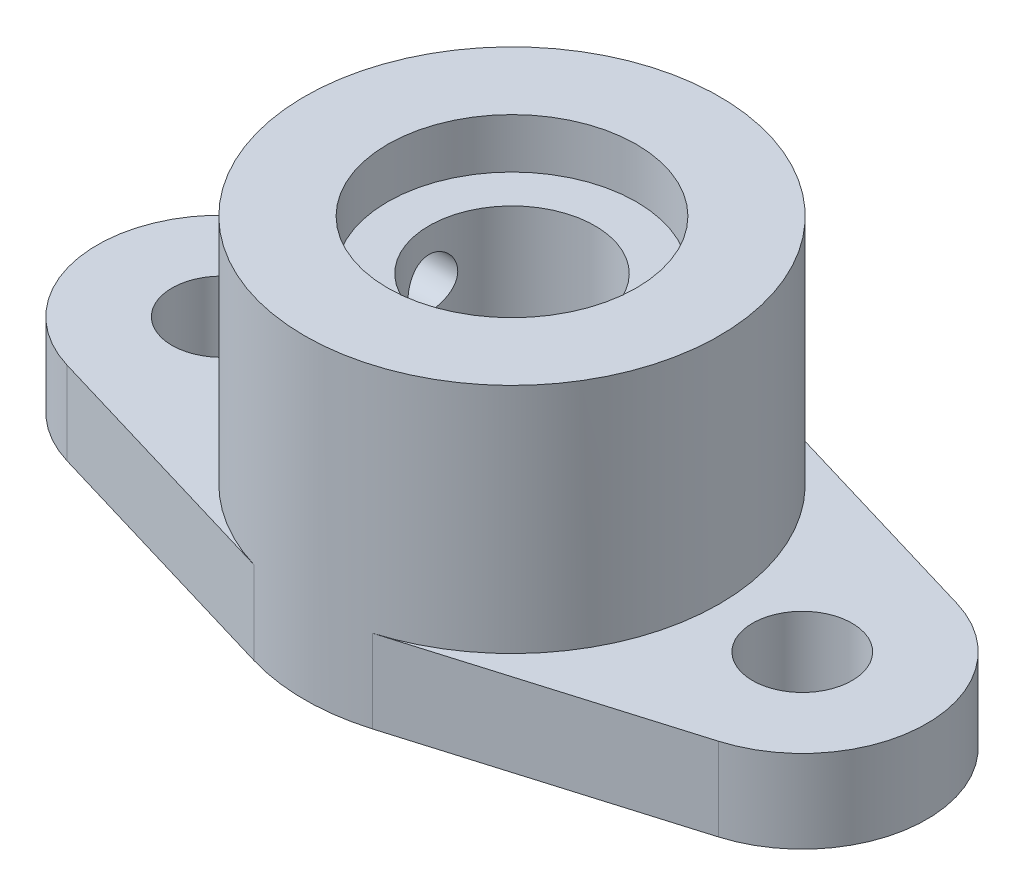
ISO-10303-21;
HEADER;
FILE_DESCRIPTION(('STEP AP214'),'2;1');
FILE_NAME('part.step','',(''),(''),'','','');
FILE_SCHEMA(('AUTOMOTIVE_DESIGN { 1 0 10303 214 1 1 1 1 }'));
ENDSEC;
DATA;
#1=APPLICATION_CONTEXT('core data for automotive mechanical design processes');
#2=APPLICATION_PROTOCOL_DEFINITION('international standard','automotive_design',2000,#1);
#3=PRODUCT_CONTEXT('',#1,'mechanical');
#4=PRODUCT('Part','Part','',(#3));
#5=PRODUCT_RELATED_PRODUCT_CATEGORY('part','',(#4));
#6=PRODUCT_DEFINITION_FORMATION('','',#4);
#7=PRODUCT_DEFINITION_CONTEXT('part definition',#1,'design');
#8=PRODUCT_DEFINITION('design','',#6,#7);
#9=PRODUCT_DEFINITION_SHAPE('','',#8);
#10=(LENGTH_UNIT() NAMED_UNIT(*) SI_UNIT(.MILLI.,.METRE.));
#11=(NAMED_UNIT(*) PLANE_ANGLE_UNIT() SI_UNIT($,.RADIAN.));
#12=(NAMED_UNIT(*) SI_UNIT($,.STERADIAN.) SOLID_ANGLE_UNIT());
#13=UNCERTAINTY_MEASURE_WITH_UNIT(LENGTH_MEASURE(1.E-05),#10,'distance_accuracy_value','');
#14=(GEOMETRIC_REPRESENTATION_CONTEXT(3) GLOBAL_UNCERTAINTY_ASSIGNED_CONTEXT((#13)) GLOBAL_UNIT_ASSIGNED_CONTEXT((#10,
#11,#12)) REPRESENTATION_CONTEXT('',''));
#15=CARTESIAN_POINT('',(0.,0.,0.));
#16=DIRECTION('',(0.,0.,1.));
#17=DIRECTION('',(1.,0.,0.));
#18=AXIS2_PLACEMENT_3D('',#15,#16,#17);
#19=CARTESIAN_POINT('',(-7.14285714285713,10.,-23.9578711874977));
#20=DIRECTION('',(-0.285714285714286,0.,-0.95831484749991));
#21=DIRECTION('',(-0.95831484749991,0.,0.285714285714286));
#22=AXIS2_PLACEMENT_3D('',#19,#20,#21);
#23=PLANE('',#22);
#24=DIRECTION('',(0.95831484749991,0.,-0.285714285714286));
#25=VECTOR('',#24,1.);
#26=CARTESIAN_POINT('',(-7.14285714285713,0.,-23.9578711874977));
#27=LINE('',#26,#25);
#28=CARTESIAN_POINT('',(-39.2857142857143,0.,-14.3747227124986));
#29=VERTEX_POINT('',#28);
#30=CARTESIAN_POINT('',(-7.14285714285714,0.,-23.9578711874978));
#31=VERTEX_POINT('',#30);
#32=EDGE_CURVE('E178',#29,#31,#27,.T.);
#33=ORIENTED_EDGE('',*,*,#32,.F.);
#34=DIRECTION('',(0.,-1.,0.));
#35=VECTOR('',#34,1.);
#36=CARTESIAN_POINT('',(-39.2857142857143,10.,-14.3747227124986));
#37=LINE('',#36,#35);
#38=CARTESIAN_POINT('',(-39.2857142857143,10.,-14.3747227124986));
#39=VERTEX_POINT('',#38);
#40=EDGE_CURVE('E48',#39,#29,#37,.T.);
#41=ORIENTED_EDGE('',*,*,#40,.F.);
#42=DIRECTION('',(0.95831484749991,0.,-0.285714285714286));
#43=VECTOR('',#42,1.);
#44=CARTESIAN_POINT('',(-7.14285714285713,10.,-23.9578711874977));
#45=LINE('',#44,#43);
#46=CARTESIAN_POINT('',(-7.14285714285713,10.,-23.9578711874977));
#47=VERTEX_POINT('',#46);
#48=EDGE_CURVE('E163',#39,#47,#45,.T.);
#49=ORIENTED_EDGE('',*,*,#48,.T.);
#50=DIRECTION('',(0.,-1.,0.));
#51=VECTOR('',#50,1.);
#52=CARTESIAN_POINT('',(-7.14285714285714,10.,-23.9578711874977));
#53=LINE('',#52,#51);
#54=EDGE_CURVE('E175',#47,#31,#53,.T.);
#55=ORIENTED_EDGE('',*,*,#54,.T.);
#56=EDGE_LOOP('',(#33,#41,#49,#55));
#57=FACE_BOUND('',#56,.T.);
#58=ADVANCED_FACE('F34',(#57),#23,.T.);
#59=CARTESIAN_POINT('',(-35.,10.,0.));
#60=DIRECTION('',(0.,-1.,0.));
#61=DIRECTION('',(0.,0.,-1.));
#62=AXIS2_PLACEMENT_3D('',#59,#60,#61);
#63=CYLINDRICAL_SURFACE('',#62,15.);
#64=CARTESIAN_POINT('',(-35.,0.,0.));
#65=DIRECTION('',(0.,1.,0.));
#66=DIRECTION('',(0.,0.,1.));
#67=AXIS2_PLACEMENT_3D('',#64,#65,#66);
#68=CIRCLE('',#67,15.);
#69=CARTESIAN_POINT('',(-39.2857142857143,0.,14.3747227124986));
#70=VERTEX_POINT('',#69);
#71=EDGE_CURVE('E181',#29,#70,#68,.T.);
#72=ORIENTED_EDGE('',*,*,#71,.T.);
#73=DIRECTION('',(0.,-1.,0.));
#74=VECTOR('',#73,1.);
#75=CARTESIAN_POINT('',(-39.2857142857143,10.,14.3747227124986));
#76=LINE('',#75,#74);
#77=CARTESIAN_POINT('',(-39.2857142857143,10.,14.3747227124986));
#78=VERTEX_POINT('',#77);
#79=EDGE_CURVE('E191',#78,#70,#76,.T.);
#80=ORIENTED_EDGE('',*,*,#79,.F.);
#81=CARTESIAN_POINT('',(-35.,10.,0.));
#82=DIRECTION('',(0.,1.,0.));
#83=DIRECTION('',(0.,0.,1.));
#84=AXIS2_PLACEMENT_3D('',#81,#82,#83);
#85=CIRCLE('',#84,15.);
#86=EDGE_CURVE('E167',#39,#78,#85,.T.);
#87=ORIENTED_EDGE('',*,*,#86,.F.);
#88=ORIENTED_EDGE('',*,*,#40,.T.);
#89=EDGE_LOOP('',(#72,#80,#87,#88));
#90=FACE_BOUND('',#89,.T.);
#91=ADVANCED_FACE('F197',(#90),#63,.T.);
#92=CARTESIAN_POINT('',(-7.14285714285713,10.,23.9578711874977));
#93=DIRECTION('',(0.285714285714286,0.,-0.95831484749991));
#94=DIRECTION('',(-0.95831484749991,0.,-0.285714285714286));
#95=AXIS2_PLACEMENT_3D('',#92,#93,#94);
#96=PLANE('',#95);
#97=DIRECTION('',(0.95831484749991,0.,0.285714285714286));
#98=VECTOR('',#97,1.);
#99=CARTESIAN_POINT('',(-7.14285714285713,0.,23.9578711874977));
#100=LINE('',#99,#98);
#101=CARTESIAN_POINT('',(-7.14285714285714,0.,23.9578711874977));
#102=VERTEX_POINT('',#101);
#103=EDGE_CURVE('E164',#70,#102,#100,.T.);
#104=ORIENTED_EDGE('',*,*,#103,.T.);
#105=DIRECTION('',(0.,-1.,0.));
#106=VECTOR('',#105,1.);
#107=CARTESIAN_POINT('',(-7.14285714285714,10.,23.9578711874977));
#108=LINE('',#107,#106);
#109=CARTESIAN_POINT('',(-7.14285714285713,10.,23.9578711874977));
#110=VERTEX_POINT('',#109);
#111=EDGE_CURVE('E188',#110,#102,#108,.T.);
#112=ORIENTED_EDGE('',*,*,#111,.F.);
#113=DIRECTION('',(0.95831484749991,0.,0.285714285714286));
#114=VECTOR('',#113,1.);
#115=CARTESIAN_POINT('',(-7.14285714285713,10.,23.9578711874977));
#116=LINE('',#115,#114);
#117=EDGE_CURVE('E170',#78,#110,#116,.T.);
#118=ORIENTED_EDGE('',*,*,#117,.F.);
#119=ORIENTED_EDGE('',*,*,#79,.T.);
#120=EDGE_LOOP('',(#104,#112,#118,#119));
#121=FACE_BOUND('',#120,.T.);
#122=ADVANCED_FACE('F225',(#121),#96,.F.);
#123=CARTESIAN_POINT('',(-35.,10.,0.));
#124=DIRECTION('',(0.,-1.,0.));
#125=DIRECTION('',(0.,0.,-1.));
#126=AXIS2_PLACEMENT_3D('',#123,#124,#125);
#127=CYLINDRICAL_SURFACE('',#126,6.);
#128=CARTESIAN_POINT('',(-35.,10.,0.));
#129=DIRECTION('',(0.,1.,0.));
#130=DIRECTION('',(0.,0.,1.));
#131=AXIS2_PLACEMENT_3D('',#128,#129,#130);
#132=CIRCLE('',#131,6.);
#133=CARTESIAN_POINT('',(-35.,10.,6.00000000000002));
#134=VERTEX_POINT('',#133);
#135=EDGE_CURVE('E160',#134,#134,#132,.T.);
#136=ORIENTED_EDGE('',*,*,#135,.T.);
#137=EDGE_LOOP('',(#136));
#138=FACE_BOUND('',#137,.T.);
#139=CARTESIAN_POINT('',(-35.,0.,0.));
#140=DIRECTION('',(0.,1.,0.));
#141=DIRECTION('',(0.,0.,1.));
#142=AXIS2_PLACEMENT_3D('',#139,#140,#141);
#143=CIRCLE('',#142,6.);
#144=CARTESIAN_POINT('',(-35.,0.,6.00000000000002));
#145=VERTEX_POINT('',#144);
#146=EDGE_CURVE('E158',#145,#145,#143,.T.);
#147=ORIENTED_EDGE('',*,*,#146,.F.);
#148=EDGE_LOOP('',(#147));
#149=FACE_BOUND('',#148,.T.);
#150=ADVANCED_FACE('F36',(#138,#149),#127,.F.);
#151=CARTESIAN_POINT('',(0.,10.,0.));
#152=DIRECTION('',(0.,1.,0.));
#153=DIRECTION('',(0.,0.,1.));
#154=AXIS2_PLACEMENT_3D('',#151,#152,#153);
#155=PLANE('',#154);
#156=ORIENTED_EDGE('',*,*,#135,.F.);
#157=EDGE_LOOP('',(#156));
#158=FACE_BOUND('',#157,.T.);
#159=ORIENTED_EDGE('',*,*,#48,.F.);
#160=ORIENTED_EDGE('',*,*,#86,.T.);
#161=ORIENTED_EDGE('',*,*,#117,.T.);
#162=CARTESIAN_POINT('',(0.,10.,0.));
#163=DIRECTION('',(0.,1.,0.));
#164=DIRECTION('',(0.,0.,1.));
#165=AXIS2_PLACEMENT_3D('',#162,#163,#164);
#166=CIRCLE('',#165,25.);
#167=EDGE_CURVE('E173',#47,#110,#166,.T.);
#168=ORIENTED_EDGE('',*,*,#167,.F.);
#169=EDGE_LOOP('',(#159,#160,#161,#168));
#170=FACE_BOUND('',#169,.T.);
#171=ADVANCED_FACE('F233',(#158,#170),#155,.T.);
#172=CARTESIAN_POINT('',(0.,0.,0.));
#173=DIRECTION('',(0.,1.,0.));
#174=DIRECTION('',(0.,0.,1.));
#175=AXIS2_PLACEMENT_3D('',#172,#173,#174);
#176=PLANE('',#175);
#177=ORIENTED_EDGE('',*,*,#146,.T.);
#178=EDGE_LOOP('',(#177));
#179=FACE_BOUND('',#178,.T.);
#180=ORIENTED_EDGE('',*,*,#32,.T.);
#181=CARTESIAN_POINT('',(0.,0.,0.));
#182=DIRECTION('',(0.,1.,0.));
#183=DIRECTION('',(0.,0.,1.));
#184=AXIS2_PLACEMENT_3D('',#181,#182,#183);
#185=CIRCLE('',#184,25.);
#186=CARTESIAN_POINT('',(7.14285714285714,0.,-23.9578711874977));
#187=VERTEX_POINT('',#186);
#188=EDGE_CURVE('E115',#187,#31,#185,.T.);
#189=ORIENTED_EDGE('',*,*,#188,.F.);
#190=DIRECTION('',(-0.95831484749991,0.,-0.285714285714286));
#191=VECTOR('',#190,1.);
#192=CARTESIAN_POINT('',(7.14285714285713,0.,-23.9578711874977));
#193=LINE('',#192,#191);
#194=CARTESIAN_POINT('',(39.2857142857143,0.,-14.3747227124986));
#195=VERTEX_POINT('',#194);
#196=EDGE_CURVE('E143',#195,#187,#193,.T.);
#197=ORIENTED_EDGE('',*,*,#196,.F.);
#198=CARTESIAN_POINT('',(35.,0.,0.));
#199=DIRECTION('',(0.,1.,0.));
#200=DIRECTION('',(0.,0.,1.));
#201=AXIS2_PLACEMENT_3D('',#198,#199,#200);
#202=CIRCLE('',#201,15.);
#203=CARTESIAN_POINT('',(39.2857142857143,0.,14.3747227124986));
#204=VERTEX_POINT('',#203);
#205=EDGE_CURVE('E111',#195,#204,#202,.F.);
#206=ORIENTED_EDGE('',*,*,#205,.T.);
#207=DIRECTION('',(-0.95831484749991,0.,0.285714285714286));
#208=VECTOR('',#207,1.);
#209=CARTESIAN_POINT('',(7.14285714285713,0.,23.9578711874977));
#210=LINE('',#209,#208);
#211=CARTESIAN_POINT('',(7.14285714285714,0.,23.9578711874978));
#212=VERTEX_POINT('',#211);
#213=EDGE_CURVE('E130',#204,#212,#210,.T.);
#214=ORIENTED_EDGE('',*,*,#213,.T.);
#215=EDGE_CURVE('E155',#102,#212,#185,.T.);
#216=ORIENTED_EDGE('',*,*,#215,.F.);
#217=ORIENTED_EDGE('',*,*,#103,.F.);
#218=ORIENTED_EDGE('',*,*,#71,.F.);
#219=EDGE_LOOP('',(#180,#189,#197,#206,#214,#216,#217,#218));
#220=FACE_BOUND('',#219,.T.);
#221=CARTESIAN_POINT('',(35.,0.,0.));
#222=DIRECTION('',(0.,1.,0.));
#223=DIRECTION('',(0.,0.,1.));
#224=AXIS2_PLACEMENT_3D('',#221,#222,#223);
#225=CIRCLE('',#224,5.99999999999999);
#226=CARTESIAN_POINT('',(35.,0.,6.00000000000001));
#227=VERTEX_POINT('',#226);
#228=EDGE_CURVE('E127',#227,#227,#225,.F.);
#229=ORIENTED_EDGE('',*,*,#228,.F.);
#230=EDGE_LOOP('',(#229));
#231=FACE_BOUND('',#230,.T.);
#232=CARTESIAN_POINT('',(0.,0.,0.));
#233=DIRECTION('',(0.,1.,0.));
#234=DIRECTION('',(0.,0.,1.));
#235=AXIS2_PLACEMENT_3D('',#232,#233,#234);
#236=CIRCLE('',#235,10.);
#237=CARTESIAN_POINT('',(0.,0.,10.));
#238=VERTEX_POINT('',#237);
#239=EDGE_CURVE('E133',#238,#238,#236,.T.);
#240=ORIENTED_EDGE('',*,*,#239,.T.);
#241=EDGE_LOOP('',(#240));
#242=FACE_BOUND('',#241,.T.);
#243=ADVANCED_FACE('F203',(#179,#220,#231,#242),#176,.F.);
#244=CARTESIAN_POINT('',(0.,38.,0.));
#245=DIRECTION('',(0.,-1.,0.));
#246=DIRECTION('',(0.,0.,-1.));
#247=AXIS2_PLACEMENT_3D('',#244,#245,#246);
#248=CYLINDRICAL_SURFACE('',#247,25.);
#249=CARTESIAN_POINT('',(-24.8193472919817,26.,-3.));
#250=CARTESIAN_POINT('',(-24.819349617552,26.1678591411999,-2.99999283172714));
#251=CARTESIAN_POINT('',(-24.8210685774632,26.3358245201498,-2.98586413495824));
#252=CARTESIAN_POINT('',(-24.8277564496116,26.6670846120579,-2.92972318709126));
#253=CARTESIAN_POINT('',(-24.8327287982131,26.8303741956863,-2.88768145238964));
#254=CARTESIAN_POINT('',(-24.8453523109071,27.1474384055045,-2.77696834616031));
#255=CARTESIAN_POINT('',(-24.8530016988387,27.3012192611337,-2.708314627898));
#256=CARTESIAN_POINT('',(-24.8701152498661,27.5950471421034,-2.5463633755789));
#257=CARTESIAN_POINT('',(-24.8795790917656,27.7350965915686,-2.45307020212001));
#258=CARTESIAN_POINT('',(-24.8993100054925,27.9982397716095,-2.24397143930053));
#259=CARTESIAN_POINT('',(-24.9095805816582,28.1212522943484,-2.1280639725065));
#260=CARTESIAN_POINT('',(-24.9297361585383,28.3461287181621,-1.87724586434875));
#261=CARTESIAN_POINT('',(-24.9396211403948,28.4479915859418,-1.74233429505413));
#262=CARTESIAN_POINT('',(-24.9579274023082,28.6279665329362,-1.45682956846799));
#263=CARTESIAN_POINT('',(-24.9663441380671,28.7060054157396,-1.30618995384899));
#264=CARTESIAN_POINT('',(-24.9807271243236,28.8356484603847,-0.993825767272776));
#265=CARTESIAN_POINT('',(-24.9866934589465,28.8872535297477,-0.832101576085543));
#266=CARTESIAN_POINT('',(-24.9954787324527,28.9623222561034,-0.502987856985085));
#267=CARTESIAN_POINT('',(-24.9983127364408,28.9859206534458,-0.335629471043381));
#268=CARTESIAN_POINT('',(-25.0005654366101,29.0047235993105,0.000694496668563946));
#269=CARTESIAN_POINT('',(-24.9999842572034,28.9999291821582,0.169660019668338));
#270=CARTESIAN_POINT('',(-24.9954842925266,28.9621908781486,0.503485667517529));
#271=CARTESIAN_POINT('',(-24.9915826884338,28.9293918950276,0.668362437568212));
#272=CARTESIAN_POINT('',(-24.9808996422381,28.836801848284,0.990254370091176));
#273=CARTESIAN_POINT('',(-24.9741181490466,28.7770103058184,1.1472693930426));
#274=CARTESIAN_POINT('',(-24.9584077904554,28.6319772710935,1.44943112325937));
#275=CARTESIAN_POINT('',(-24.9494736188692,28.5466727639936,1.59454729727538));
#276=CARTESIAN_POINT('',(-24.9304580967161,28.3530811010438,1.86845892019878));
#277=CARTESIAN_POINT('',(-24.9203766976596,28.2447929735844,1.99725367876689));
#278=CARTESIAN_POINT('',(-24.9001206745296,28.0074956504595,2.23571721123049));
#279=CARTESIAN_POINT('',(-24.8899458632542,27.8783602186265,2.34526038878379));
#280=CARTESIAN_POINT('',(-24.8707126046075,27.6034684863205,2.54113591825157));
#281=CARTESIAN_POINT('',(-24.8616541602595,27.4577121408355,2.62746820730525));
#282=CARTESIAN_POINT('',(-24.8456792055215,27.1536075098526,2.77447678358649));
#283=CARTESIAN_POINT('',(-24.8387634934567,26.9952545587421,2.83514351157641));
#284=CARTESIAN_POINT('',(-24.8278728306612,26.6705076404988,2.92899010032377));
#285=CARTESIAN_POINT('',(-24.8238977496732,26.5041140298807,2.96217117858551));
#286=CARTESIAN_POINT('',(-24.8193620015637,26.1691169036233,2.99993928712165));
#287=CARTESIAN_POINT('',(-24.8187802560634,26.0005335641189,3.00470284270772));
#288=CARTESIAN_POINT('',(-24.8210413301146,25.6649712191571,2.98596598055603));
#289=CARTESIAN_POINT('',(-24.82388408253,25.4979921823126,2.96246611691248));
#290=CARTESIAN_POINT('',(-24.8326546274979,25.170904216402,2.88801791942018));
#291=CARTESIAN_POINT('',(-24.8385728602158,25.0107756531907,2.83715462498938));
#292=CARTESIAN_POINT('',(-24.8528197853248,24.701320717024,2.70951076792624));
#293=CARTESIAN_POINT('',(-24.8611485560914,24.551994695497,2.63272936258612));
#294=CARTESIAN_POINT('',(-24.8793287313299,24.2675837050254,2.45499302721611));
#295=CARTESIAN_POINT('',(-24.8891873609855,24.1325717131187,2.35392207141476));
#296=CARTESIAN_POINT('',(-24.9092935540369,23.8813648869882,2.13064017836707));
#297=CARTESIAN_POINT('',(-24.9195411313438,23.7651707265941,2.0084284844362));
#298=CARTESIAN_POINT('',(-24.939335094491,23.5542802527651,1.74556427266772));
#299=CARTESIAN_POINT('',(-24.9488775256031,23.4596997534886,1.60481849941783));
#300=CARTESIAN_POINT('',(-24.966127243116,23.2955217906709,1.30933642941058));
#301=CARTESIAN_POINT('',(-24.9738345640038,23.2259238576256,1.15460039564442));
#302=CARTESIAN_POINT('',(-24.9865280430514,23.1138789951242,0.835919244719986));
#303=CARTESIAN_POINT('',(-24.9915209702628,23.0713644801158,0.671998170647182));
#304=CARTESIAN_POINT('',(-24.9982511364507,23.0144732564178,0.339280584991478));
#305=CARTESIAN_POINT('',(-24.9999885101567,23.0000953833069,0.17048427546126));
#306=CARTESIAN_POINT('',(-25.0000113048646,22.9999061558877,-0.166060006255656));
#307=CARTESIAN_POINT('',(-24.9983183365244,23.0139159633168,-0.333807904658862));
#308=CARTESIAN_POINT('',(-24.9917135402075,23.0697264549025,-0.664547224796242));
#309=CARTESIAN_POINT('',(-24.9868017132859,23.1115271299496,-0.827538648089517));
#310=CARTESIAN_POINT('',(-24.9743088019473,23.2216780151315,-1.14411955598358));
#311=CARTESIAN_POINT('',(-24.9667285079088,23.2900203644542,-1.29771180874788));
#312=CARTESIAN_POINT('',(-24.9497392443223,23.4512960695847,-1.59127541052543));
#313=CARTESIAN_POINT('',(-24.9403302599753,23.5442296244038,-1.73124664929415));
#314=CARTESIAN_POINT('',(-24.920663936203,23.7527136820053,-1.99450948424813));
#315=CARTESIAN_POINT('',(-24.910401817522,23.8683973553221,-2.11769526787512));
#316=CARTESIAN_POINT('',(-24.8902246865463,24.1188230371561,-2.34297730712577));
#317=CARTESIAN_POINT('',(-24.88030975725,24.2535695645149,-2.44506854813713));
#318=CARTESIAN_POINT('',(-24.8619119204259,24.538842936159,-2.62557074728252));
#319=CARTESIAN_POINT('',(-24.8534342444193,24.6894243282266,-2.70389598198192));
#320=CARTESIAN_POINT('',(-24.8389322365013,25.001617753704,-2.8340380582164));
#321=CARTESIAN_POINT('',(-24.8329052161653,25.1632174711855,-2.88588396425552));
#322=CARTESIAN_POINT('',(-24.8254627238532,25.4380595391116,-2.94907010073915));
#323=CARTESIAN_POINT('',(-24.8231807309863,25.5495627519623,-2.96814164942005));
#324=CARTESIAN_POINT('',(-24.8201222373143,25.7740279321319,-2.99360896909453));
#325=CARTESIAN_POINT('',(-24.8193457263061,25.8869898895593,-3.00000482599459));
#326=CARTESIAN_POINT('',(-24.8193472919817,26.,-3.));
#327=B_SPLINE_CURVE_WITH_KNOTS('',3,(#249,#250,#251,#252,#253,#254,#255,#256,#257,#258,#259,
#260,#261,#262,#263,#264,#265,#266,#267,#268,#269,#270,#271,#272,#273,#274,#275,#276,#277,#278,
#279,#280,#281,#282,#283,#284,#285,#286,#287,#288,#289,#290,#291,#292,#293,#294,#295,#296,#297,
#298,#299,#300,#301,#302,#303,#304,#305,#306,#307,#308,#309,#310,#311,#312,#313,#314,#315,#316,
#317,#318,#319,#320,#321,#322,#323,#324,#325,#326),.UNSPECIFIED.,.T.,.F.,(4,2,2,2,2,2,2,2,2,2,2,
2,2,2,2,2,2,2,2,2,2,2,2,2,2,2,2,2,2,2,2,2,2,2,2,2,2,2,4),(0.,0.503164613232921,1.00686154966524,
1.51022492507114,2.01349927674882,2.51909553323416,3.02471648549882,3.531875617562,
4.03901733675556,4.54370917218765,5.04838262225285,5.55046046161349,6.05254720809332,
6.55588445357932,7.05924298138498,7.56577244411506,8.07230327863779,8.57902260679249,
9.08571948810824,9.58926554088957,10.0928017219916,10.5947819896887,11.0967785804672,
11.6012225031328,12.105684484956,12.6127892929794,13.119884570345,13.6257094034364,
14.1315133027652,14.6341406188081,15.1367677700954,15.6392461723566,16.1417286411941,
16.6472450412647,17.1528814752089,17.6603206216507,18.1672015841626,18.5059562893408,
18.8447086986815),.UNSPECIFIED.);
#328=CARTESIAN_POINT('',(-24.8193472919817,26.,-3.));
#329=VERTEX_POINT('',#328);
#330=EDGE_CURVE('E249',#329,#329,#327,.T.);
#331=ORIENTED_EDGE('',*,*,#330,.T.);
#332=EDGE_LOOP('',(#331));
#333=FACE_BOUND('',#332,.T.);
#334=CARTESIAN_POINT('',(0.,10.,0.));
#335=DIRECTION('',(0.,1.,0.));
#336=DIRECTION('',(0.,0.,1.));
#337=AXIS2_PLACEMENT_3D('',#334,#335,#336);
#338=CIRCLE('',#337,25.);
#339=CARTESIAN_POINT('',(7.14285714285714,10.,23.9578711874977));
#340=VERTEX_POINT('',#339);
#341=CARTESIAN_POINT('',(7.14285714285713,10.,-23.9578711874977));
#342=VERTEX_POINT('',#341);
#343=EDGE_CURVE('E55',#340,#342,#338,.T.);
#344=ORIENTED_EDGE('',*,*,#343,.T.);
#345=DIRECTION('',(0.,-1.,0.));
#346=VECTOR('',#345,1.);
#347=CARTESIAN_POINT('',(7.14285714285714,10.,-23.9578711874977));
#348=LINE('',#347,#346);
#349=EDGE_CURVE('E116',#342,#187,#348,.T.);
#350=ORIENTED_EDGE('',*,*,#349,.T.);
#351=ORIENTED_EDGE('',*,*,#188,.T.);
#352=ORIENTED_EDGE('',*,*,#54,.F.);
#353=ORIENTED_EDGE('',*,*,#167,.T.);
#354=ORIENTED_EDGE('',*,*,#111,.T.);
#355=ORIENTED_EDGE('',*,*,#215,.T.);
#356=DIRECTION('',(0.,-1.,0.));
#357=VECTOR('',#356,1.);
#358=CARTESIAN_POINT('',(7.14285714285714,10.,23.9578711874977));
#359=LINE('',#358,#357);
#360=EDGE_CURVE('E60',#340,#212,#359,.T.);
#361=ORIENTED_EDGE('',*,*,#360,.F.);
#362=EDGE_LOOP('',(#344,#350,#351,#352,#353,#354,#355,#361));
#363=FACE_BOUND('',#362,.T.);
#364=CARTESIAN_POINT('',(0.,38.,0.));
#365=DIRECTION('',(0.,1.,0.));
#366=DIRECTION('',(0.,0.,1.));
#367=AXIS2_PLACEMENT_3D('',#364,#365,#366);
#368=CIRCLE('',#367,25.);
#369=CARTESIAN_POINT('',(0.,38.,25.));
#370=VERTEX_POINT('',#369);
#371=EDGE_CURVE('E154',#370,#370,#368,.T.);
#372=ORIENTED_EDGE('',*,*,#371,.F.);
#373=EDGE_LOOP('',(#372));
#374=FACE_BOUND('',#373,.T.);
#375=ADVANCED_FACE('F206',(#333,#363,#374),#248,.T.);
#376=CARTESIAN_POINT('',(0.,38.,0.));
#377=DIRECTION('',(0.,-1.,0.));
#378=DIRECTION('',(0.,0.,-1.));
#379=AXIS2_PLACEMENT_3D('',#376,#377,#378);
#380=CYLINDRICAL_SURFACE('',#379,15.);
#381=CARTESIAN_POINT('',(0.,32.,0.));
#382=DIRECTION('',(0.,1.,0.));
#383=DIRECTION('',(0.,0.,1.));
#384=AXIS2_PLACEMENT_3D('',#381,#382,#383);
#385=CIRCLE('',#384,15.);
#386=CARTESIAN_POINT('',(0.,32.,15.));
#387=VERTEX_POINT('',#386);
#388=EDGE_CURVE('E11',#387,#387,#385,.T.);
#389=ORIENTED_EDGE('',*,*,#388,.F.);
#390=EDGE_LOOP('',(#389));
#391=FACE_BOUND('',#390,.T.);
#392=CARTESIAN_POINT('',(0.,38.,0.));
#393=DIRECTION('',(0.,1.,0.));
#394=DIRECTION('',(0.,0.,1.));
#395=AXIS2_PLACEMENT_3D('',#392,#393,#394);
#396=CIRCLE('',#395,15.);
#397=CARTESIAN_POINT('',(0.,38.,15.));
#398=VERTEX_POINT('',#397);
#399=EDGE_CURVE('E151',#398,#398,#396,.T.);
#400=ORIENTED_EDGE('',*,*,#399,.T.);
#401=EDGE_LOOP('',(#400));
#402=FACE_BOUND('',#401,.T.);
#403=ADVANCED_FACE('F238',(#391,#402),#380,.F.);
#404=CARTESIAN_POINT('',(0.,38.,0.));
#405=DIRECTION('',(0.,1.,0.));
#406=DIRECTION('',(0.,0.,1.));
#407=AXIS2_PLACEMENT_3D('',#404,#405,#406);
#408=PLANE('',#407);
#409=ORIENTED_EDGE('',*,*,#399,.F.);
#410=EDGE_LOOP('',(#409));
#411=FACE_BOUND('',#410,.T.);
#412=ORIENTED_EDGE('',*,*,#371,.T.);
#413=EDGE_LOOP('',(#412));
#414=FACE_BOUND('',#413,.T.);
#415=ADVANCED_FACE('F241',(#411,#414),#408,.T.);
#416=CARTESIAN_POINT('',(35.,10.,0.));
#417=DIRECTION('',(0.,-1.,0.));
#418=DIRECTION('',(0.,0.,-1.));
#419=AXIS2_PLACEMENT_3D('',#416,#417,#418);
#420=CYLINDRICAL_SURFACE('',#419,15.);
#421=ORIENTED_EDGE('',*,*,#205,.F.);
#422=DIRECTION('',(0.,-1.,0.));
#423=VECTOR('',#422,1.);
#424=CARTESIAN_POINT('',(39.2857142857143,10.,-14.3747227124986));
#425=LINE('',#424,#423);
#426=CARTESIAN_POINT('',(39.2857142857143,10.,-14.3747227124986));
#427=VERTEX_POINT('',#426);
#428=EDGE_CURVE('E104',#427,#195,#425,.T.);
#429=ORIENTED_EDGE('',*,*,#428,.F.);
#430=CARTESIAN_POINT('',(35.,10.,0.));
#431=DIRECTION('',(0.,1.,0.));
#432=DIRECTION('',(0.,0.,1.));
#433=AXIS2_PLACEMENT_3D('',#430,#431,#432);
#434=CIRCLE('',#433,15.);
#435=CARTESIAN_POINT('',(39.2857142857143,10.,14.3747227124986));
#436=VERTEX_POINT('',#435);
#437=EDGE_CURVE('E108',#427,#436,#434,.F.);
#438=ORIENTED_EDGE('',*,*,#437,.T.);
#439=DIRECTION('',(0.,-1.,0.));
#440=VECTOR('',#439,1.);
#441=CARTESIAN_POINT('',(39.2857142857143,10.,14.3747227124986));
#442=LINE('',#441,#440);
#443=EDGE_CURVE('E141',#436,#204,#442,.T.);
#444=ORIENTED_EDGE('',*,*,#443,.T.);
#445=EDGE_LOOP('',(#421,#429,#438,#444));
#446=FACE_BOUND('',#445,.T.);
#447=ADVANCED_FACE('F106',(#446),#420,.T.);
#448=CARTESIAN_POINT('',(7.14285714285713,10.,-23.9578711874977));
#449=DIRECTION('',(-0.285714285714286,0.,0.95831484749991));
#450=DIRECTION('',(0.95831484749991,0.,0.285714285714286));
#451=AXIS2_PLACEMENT_3D('',#448,#449,#450);
#452=PLANE('',#451);
#453=ORIENTED_EDGE('',*,*,#196,.T.);
#454=ORIENTED_EDGE('',*,*,#349,.F.);
#455=DIRECTION('',(-0.95831484749991,0.,-0.285714285714286));
#456=VECTOR('',#455,1.);
#457=CARTESIAN_POINT('',(7.14285714285713,10.,-23.9578711874977));
#458=LINE('',#457,#456);
#459=EDGE_CURVE('E119',#427,#342,#458,.T.);
#460=ORIENTED_EDGE('',*,*,#459,.F.);
#461=ORIENTED_EDGE('',*,*,#428,.T.);
#462=EDGE_LOOP('',(#453,#454,#460,#461));
#463=FACE_BOUND('',#462,.T.);
#464=ADVANCED_FACE('F120',(#463),#452,.F.);
#465=CARTESIAN_POINT('',(7.14285714285713,10.,23.9578711874977));
#466=DIRECTION('',(0.285714285714286,0.,0.95831484749991));
#467=DIRECTION('',(0.95831484749991,0.,-0.285714285714286));
#468=AXIS2_PLACEMENT_3D('',#465,#466,#467);
#469=PLANE('',#468);
#470=ORIENTED_EDGE('',*,*,#213,.F.);
#471=ORIENTED_EDGE('',*,*,#443,.F.);
#472=DIRECTION('',(-0.95831484749991,0.,0.285714285714286));
#473=VECTOR('',#472,1.);
#474=CARTESIAN_POINT('',(7.14285714285713,10.,23.9578711874977));
#475=LINE('',#474,#473);
#476=EDGE_CURVE('E126',#436,#340,#475,.T.);
#477=ORIENTED_EDGE('',*,*,#476,.T.);
#478=ORIENTED_EDGE('',*,*,#360,.T.);
#479=EDGE_LOOP('',(#470,#471,#477,#478));
#480=FACE_BOUND('',#479,.T.);
#481=ADVANCED_FACE('F210',(#480),#469,.T.);
#482=CARTESIAN_POINT('',(35.,10.,0.));
#483=DIRECTION('',(0.,-1.,0.));
#484=DIRECTION('',(0.,0.,-1.));
#485=AXIS2_PLACEMENT_3D('',#482,#483,#484);
#486=CYLINDRICAL_SURFACE('',#485,5.99999999999999);
#487=CARTESIAN_POINT('',(35.,10.,0.));
#488=DIRECTION('',(0.,1.,0.));
#489=DIRECTION('',(0.,0.,1.));
#490=AXIS2_PLACEMENT_3D('',#487,#488,#489);
#491=CIRCLE('',#490,5.99999999999999);
#492=CARTESIAN_POINT('',(35.,10.,6.00000000000001));
#493=VERTEX_POINT('',#492);
#494=EDGE_CURVE('E138',#493,#493,#491,.F.);
#495=ORIENTED_EDGE('',*,*,#494,.F.);
#496=EDGE_LOOP('',(#495));
#497=FACE_BOUND('',#496,.T.);
#498=ORIENTED_EDGE('',*,*,#228,.T.);
#499=EDGE_LOOP('',(#498));
#500=FACE_BOUND('',#499,.T.);
#501=ADVANCED_FACE('F212',(#497,#500),#486,.F.);
#502=CARTESIAN_POINT('',(0.,10.,0.));
#503=DIRECTION('',(0.,1.,0.));
#504=DIRECTION('',(0.,0.,1.));
#505=AXIS2_PLACEMENT_3D('',#502,#503,#504);
#506=PLANE('',#505);
#507=ORIENTED_EDGE('',*,*,#437,.F.);
#508=ORIENTED_EDGE('',*,*,#459,.T.);
#509=ORIENTED_EDGE('',*,*,#343,.F.);
#510=ORIENTED_EDGE('',*,*,#476,.F.);
#511=EDGE_LOOP('',(#507,#508,#509,#510));
#512=FACE_BOUND('',#511,.T.);
#513=ORIENTED_EDGE('',*,*,#494,.T.);
#514=EDGE_LOOP('',(#513));
#515=FACE_BOUND('',#514,.T.);
#516=ADVANCED_FACE('F123',(#512,#515),#506,.T.);
#517=CARTESIAN_POINT('',(0.,32.,0.));
#518=DIRECTION('',(0.,-1.,0.));
#519=DIRECTION('',(0.,0.,-1.));
#520=AXIS2_PLACEMENT_3D('',#517,#518,#519);
#521=CYLINDRICAL_SURFACE('',#520,10.);
#522=CARTESIAN_POINT('',(-9.53939201416945,26.,-3.));
#523=CARTESIAN_POINT('',(-9.5393937145396,26.1643890958848,-2.99999795267528));
#524=CARTESIAN_POINT('',(-9.54368780418137,26.328798448288,-2.98644216334284));
#525=CARTESIAN_POINT('',(-9.56033156605799,26.6528104991839,-2.93271688893498));
#526=CARTESIAN_POINT('',(-9.57268392986936,26.8124115730029,-2.89253851147156));
#527=CARTESIAN_POINT('',(-9.60392204971265,27.1220694565435,-2.78705506539911));
#528=CARTESIAN_POINT('',(-9.62279693406464,27.2721416592662,-2.72179178788487));
#529=CARTESIAN_POINT('',(-9.66493865095134,27.5592438679906,-2.56812843835858));
#530=CARTESIAN_POINT('',(-9.68820614082039,27.6962719173689,-2.47972490274105));
#531=CARTESIAN_POINT('',(-9.73733724371531,27.9577327811547,-2.27929508283254));
#532=CARTESIAN_POINT('',(-9.76325616623271,28.0816917958926,-2.16666414351613));
#533=CARTESIAN_POINT('',(-9.81429723873514,28.309275902645,-1.9222724751592));
#534=CARTESIAN_POINT('',(-9.8394192859541,28.4128983808998,-1.79050929092222));
#535=CARTESIAN_POINT('',(-9.88666429158777,28.5989253996666,-1.50822287558738));
#536=CARTESIAN_POINT('',(-9.90871448684808,28.6808468488856,-1.35736804267163));
#537=CARTESIAN_POINT('',(-9.94668871841369,28.8179745180855,-1.04324929073871));
#538=CARTESIAN_POINT('',(-9.96261407578991,28.8731864997149,-0.879988056775824));
#539=CARTESIAN_POINT('',(-9.98615292007177,28.953760002181,-0.550647705261661));
#540=CARTESIAN_POINT('',(-9.99399114738673,28.9799302553054,-0.384782797907605));
#541=CARTESIAN_POINT('',(-10.001264030027,29.0042346492929,-0.0508436474986301));
#542=CARTESIAN_POINT('',(-10.0007004504217,29.0023746788039,0.117230124100741));
#543=CARTESIAN_POINT('',(-9.99139207635305,28.971214262914,0.445142313200313));
#544=CARTESIAN_POINT('',(-9.98290840410475,28.9427896123803,0.605072535282659));
#545=CARTESIAN_POINT('',(-9.95903044225231,28.8607373280114,0.917778426885074));
#546=CARTESIAN_POINT('',(-9.9436357150134,28.8071080981145,1.07055364264577));
#547=CARTESIAN_POINT('',(-9.90730441973756,28.675575953163,1.36669465270247));
#548=CARTESIAN_POINT('',(-9.88630539352772,28.5973975943861,1.50993012938864));
#549=CARTESIAN_POINT('',(-9.84099281296777,28.419204295143,1.78152934756663));
#550=CARTESIAN_POINT('',(-9.81667847277943,28.3191841740708,1.90988954974544));
#551=CARTESIAN_POINT('',(-9.76623100973852,28.0956044984991,2.15332096305837));
#552=CARTESIAN_POINT('',(-9.74006390633502,27.9712861619492,2.26768916079755));
#553=CARTESIAN_POINT('',(-9.68967959784414,27.7049799642112,2.47415303080115));
#554=CARTESIAN_POINT('',(-9.66546258669242,27.562990349189,2.56624648967452));
#555=CARTESIAN_POINT('',(-9.62155806359712,27.2635210615278,2.72627990669511));
#556=CARTESIAN_POINT('',(-9.6019162125849,27.1059059083825,2.79397978469377));
#557=CARTESIAN_POINT('',(-9.5699278496379,26.7807855832214,2.90166725750739));
#558=CARTESIAN_POINT('',(-9.55757895796639,26.6132836569649,2.94166389279494));
#559=CARTESIAN_POINT('',(-9.54209699116239,26.2798352784976,2.99149540565762));
#560=CARTESIAN_POINT('',(-9.53863757349917,26.1140635522056,3.00239892760807));
#561=CARTESIAN_POINT('',(-9.54042384874812,25.7830541999867,2.99671894465741));
#562=CARTESIAN_POINT('',(-9.54566832310786,25.61781650254,2.98013928742559));
#563=CARTESIAN_POINT('',(-9.56395117112153,25.2970232440566,2.92091527148479));
#564=CARTESIAN_POINT('',(-9.57678353015602,25.1413276714725,2.87895922862587));
#565=CARTESIAN_POINT('',(-9.6085828246183,24.8391966183706,2.77097155495853));
#566=CARTESIAN_POINT('',(-9.62755070717977,24.692762571719,2.70493620685512));
#567=CARTESIAN_POINT('',(-9.67011670046268,24.4089650718556,2.54863742393008));
#568=CARTESIAN_POINT('',(-9.69382542139643,24.2719505580284,2.4577712834546));
#569=CARTESIAN_POINT('',(-9.74296411293927,24.0147237876384,2.25510603200767));
#570=CARTESIAN_POINT('',(-9.76839449459993,23.8945155647744,2.14330191069793));
#571=CARTESIAN_POINT('',(-9.81927267096329,23.6696391883705,1.8969102649872));
#572=CARTESIAN_POINT('',(-9.84468490126011,23.565728742026,1.76162213171487));
#573=CARTESIAN_POINT('',(-9.89169703497297,23.3820665979445,1.4749235691805));
#574=CARTESIAN_POINT('',(-9.91329712769433,23.3023137004371,1.32351394108789));
#575=CARTESIAN_POINT('',(-9.95011940949915,23.1699999388634,1.00987100941045));
#576=CARTESIAN_POINT('',(-9.96538906849931,23.117235967682,0.847729244075681));
#577=CARTESIAN_POINT('',(-9.98803959193653,23.0398781622192,0.51633993300918));
#578=CARTESIAN_POINT('',(-9.9954227134176,23.0152762681032,0.347094434709529));
#579=CARTESIAN_POINT('',(-10.001330881628,22.995553911891,0.0133043077654896));
#580=CARTESIAN_POINT('',(-10.0001861022264,22.9993346091843,-0.151170358172409));
#581=CARTESIAN_POINT('',(-9.98994528930073,23.0336432649982,-0.477038962328804));
#582=CARTESIAN_POINT('',(-9.98084970660925,23.0641697069609,-0.638433074693053));
#583=CARTESIAN_POINT('',(-9.95582336716653,23.1504233227992,-0.951871626082712));
#584=CARTESIAN_POINT('',(-9.93996705801731,23.205876361298,-1.10399785470278));
#585=CARTESIAN_POINT('',(-9.90305886078899,23.3401638290144,-1.3968664755041));
#586=CARTESIAN_POINT('',(-9.88200611899892,23.4190021005724,-1.53760699210116));
#587=CARTESIAN_POINT('',(-9.83607931656457,23.6007469148601,-1.80860378484112));
#588=CARTESIAN_POINT('',(-9.81110453847119,23.7043428600015,-1.93838050015353));
#589=CARTESIAN_POINT('',(-9.76047074424668,23.9314207766656,-2.17907514269189));
#590=CARTESIAN_POINT('',(-9.73481153282158,24.0549084757963,-2.28998761920387));
#591=CARTESIAN_POINT('',(-9.68481361262638,24.322681556621,-2.49312538789097));
#592=CARTESIAN_POINT('',(-9.66053705386971,24.4674771067809,-2.58469519515913));
#593=CARTESIAN_POINT('',(-9.61705095017586,24.771110348322,-2.74208627057551));
#594=CARTESIAN_POINT('',(-9.59783897193911,24.9299412472024,-2.80791991114577));
#595=CARTESIAN_POINT('',(-9.56855633435189,25.2394808632125,-2.90603885065899));
#596=CARTESIAN_POINT('',(-9.5577230968104,25.389217293862,-2.94117718022463));
#597=CARTESIAN_POINT('',(-9.54314085194333,25.6926304449915,-2.98815637670288));
#598=CARTESIAN_POINT('',(-9.53939042442861,25.8463063692905,-3.00000191412191));
#599=CARTESIAN_POINT('',(-9.53939201416945,26.,-3.));
#600=B_SPLINE_CURVE_WITH_KNOTS('',3,(#522,#523,#524,#525,#526,#527,#528,#529,#530,#531,#532,
#533,#534,#535,#536,#537,#538,#539,#540,#541,#542,#543,#544,#545,#546,#547,#548,#549,#550,#551,
#552,#553,#554,#555,#556,#557,#558,#559,#560,#561,#562,#563,#564,#565,#566,#567,#568,#569,#570,
#571,#572,#573,#574,#575,#576,#577,#578,#579,#580,#581,#582,#583,#584,#585,#586,#587,#588,#589,
#590,#591,#592,#593,#594,#595,#596,#597,#598,#599),.UNSPECIFIED.,.T.,.F.,(4,2,2,2,2,2,2,2,2,2,2,
2,2,2,2,2,2,2,2,2,2,2,2,2,2,2,2,2,2,2,2,2,2,2,2,2,2,2,4),(0.,0.492600331831084,
0.985365283377997,1.47731282893239,1.9693340507402,2.47546300015967,2.98165695742545,
3.49831878547289,4.01486911175754,4.51664280299115,5.0183110820288,5.5040025198176,
5.98972471780752,6.48110418671352,6.97260033181661,7.48304294046555,7.99353624983726,
8.50892476494934,9.02414501262032,9.52016161585828,10.0161087821998,10.4991718988284,
10.9823096209678,11.4784146362399,11.9746385186306,12.4895901220641,13.0045161465361,
13.5155078363386,14.0263532464857,14.5175260782765,15.0086710610072,15.4945419374965,
15.9804926898797,16.4819925411419,16.9836370526499,17.500232793435,18.016579879331,
18.477223077201,18.9377739007233),.UNSPECIFIED.);
#601=CARTESIAN_POINT('',(-9.53939201416945,26.,-3.));
#602=VERTEX_POINT('',#601);
#603=EDGE_CURVE('E38',#602,#602,#600,.T.);
#604=ORIENTED_EDGE('',*,*,#603,.F.);
#605=EDGE_LOOP('',(#604));
#606=FACE_BOUND('',#605,.T.);
#607=CARTESIAN_POINT('',(0.,32.,0.));
#608=DIRECTION('',(0.,1.,0.));
#609=DIRECTION('',(0.,0.,1.));
#610=AXIS2_PLACEMENT_3D('',#607,#608,#609);
#611=CIRCLE('',#610,10.);
#612=CARTESIAN_POINT('',(0.,32.,10.));
#613=VERTEX_POINT('',#612);
#614=EDGE_CURVE('E144',#613,#613,#611,.T.);
#615=ORIENTED_EDGE('',*,*,#614,.T.);
#616=EDGE_LOOP('',(#615));
#617=FACE_BOUND('',#616,.T.);
#618=ORIENTED_EDGE('',*,*,#239,.F.);
#619=EDGE_LOOP('',(#618));
#620=FACE_BOUND('',#619,.T.);
#621=ADVANCED_FACE('F262',(#606,#617,#620),#521,.F.);
#622=CARTESIAN_POINT('',(0.,32.,0.));
#623=DIRECTION('',(0.,1.,0.));
#624=DIRECTION('',(0.,0.,1.));
#625=AXIS2_PLACEMENT_3D('',#622,#623,#624);
#626=PLANE('',#625);
#627=ORIENTED_EDGE('',*,*,#614,.F.);
#628=EDGE_LOOP('',(#627));
#629=FACE_BOUND('',#628,.T.);
#630=ORIENTED_EDGE('',*,*,#388,.T.);
#631=EDGE_LOOP('',(#630));
#632=FACE_BOUND('',#631,.T.);
#633=ADVANCED_FACE('F258',(#629,#632),#626,.T.);
#634=CARTESIAN_POINT('',(-40.,26.,0.));
#635=DIRECTION('',(1.,0.,0.));
#636=DIRECTION('',(0.,0.,-1.));
#637=AXIS2_PLACEMENT_3D('',#634,#635,#636);
#638=CYLINDRICAL_SURFACE('',#637,3.);
#639=ORIENTED_EDGE('',*,*,#603,.T.);
#640=EDGE_LOOP('',(#639));
#641=FACE_BOUND('',#640,.T.);
#642=ORIENTED_EDGE('',*,*,#330,.F.);
#643=EDGE_LOOP('',(#642));
#644=FACE_BOUND('',#643,.T.);
#645=ADVANCED_FACE('F254',(#641,#644),#638,.F.);
#646=CLOSED_SHELL('',(#58,#91,#122,#150,#171,#243,#375,#403,#415,#447,#464,#481,#501,#516,#621,
#633,#645));
#647=MANIFOLD_SOLID_BREP('B2',#646);
#648=ADVANCED_BREP_SHAPE_REPRESENTATION('',(#18,#647),#14);
#649=SHAPE_DEFINITION_REPRESENTATION(#9,#648);
ENDSEC;
END-ISO-10303-21;
